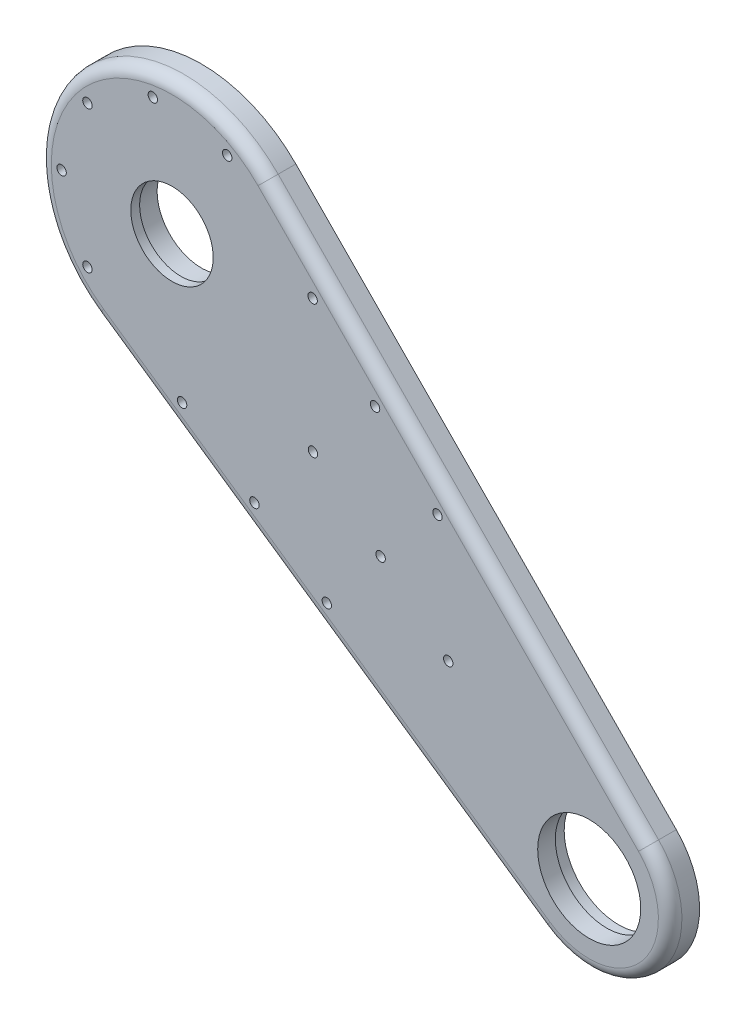
ISO-10303-21;
HEADER;
FILE_DESCRIPTION(('STEP AP214'),'2;1');
FILE_NAME('part.step','',(''),(''),'','','');
FILE_SCHEMA(('AUTOMOTIVE_DESIGN { 1 0 10303 214 1 1 1 1 }'));
ENDSEC;
DATA;
#1=APPLICATION_CONTEXT('core data for automotive mechanical design processes');
#2=APPLICATION_PROTOCOL_DEFINITION('international standard','automotive_design',2000,#1);
#3=PRODUCT_CONTEXT('',#1,'mechanical');
#4=PRODUCT('Part','Part','',(#3));
#5=PRODUCT_RELATED_PRODUCT_CATEGORY('part','',(#4));
#6=PRODUCT_DEFINITION_FORMATION('','',#4);
#7=PRODUCT_DEFINITION_CONTEXT('part definition',#1,'design');
#8=PRODUCT_DEFINITION('design','',#6,#7);
#9=PRODUCT_DEFINITION_SHAPE('','',#8);
#10=(LENGTH_UNIT() NAMED_UNIT(*) SI_UNIT(.MILLI.,.METRE.));
#11=(NAMED_UNIT(*) PLANE_ANGLE_UNIT() SI_UNIT($,.RADIAN.));
#12=(NAMED_UNIT(*) SI_UNIT($,.STERADIAN.) SOLID_ANGLE_UNIT());
#13=UNCERTAINTY_MEASURE_WITH_UNIT(LENGTH_MEASURE(1.E-05),#10,'distance_accuracy_value','');
#14=(GEOMETRIC_REPRESENTATION_CONTEXT(3) GLOBAL_UNCERTAINTY_ASSIGNED_CONTEXT((#13)) GLOBAL_UNIT_ASSIGNED_CONTEXT((#10,
#11,#12)) REPRESENTATION_CONTEXT('',''));
#15=CARTESIAN_POINT('',(0.,0.,0.));
#16=DIRECTION('',(0.,0.,1.));
#17=DIRECTION('',(1.,0.,0.));
#18=AXIS2_PLACEMENT_3D('',#15,#16,#17);
#19=CARTESIAN_POINT('',(0.,0.,47.));
#20=DIRECTION('',(0.,0.,-1.));
#21=DIRECTION('',(-1.,0.,0.));
#22=AXIS2_PLACEMENT_3D('',#19,#20,#21);
#23=CYLINDRICAL_SURFACE('',#22,14.);
#24=CARTESIAN_POINT('',(0.,0.,47.));
#25=DIRECTION('',(0.,0.,-1.));
#26=DIRECTION('',(-1.,0.,0.));
#27=AXIS2_PLACEMENT_3D('',#24,#25,#26);
#28=CIRCLE('',#27,14.);
#29=CARTESIAN_POINT('',(-14.,0.,47.));
#30=VERTEX_POINT('',#29);
#31=EDGE_CURVE('E215',#30,#30,#28,.T.);
#32=ORIENTED_EDGE('',*,*,#31,.F.);
#33=EDGE_LOOP('',(#32));
#34=FACE_BOUND('',#33,.T.);
#35=CARTESIAN_POINT('',(0.,0.,44.));
#36=DIRECTION('',(0.,0.,-1.));
#37=DIRECTION('',(-1.,0.,0.));
#38=AXIS2_PLACEMENT_3D('',#35,#36,#37);
#39=CIRCLE('',#38,14.);
#40=CARTESIAN_POINT('',(-14.,0.,44.));
#41=VERTEX_POINT('',#40);
#42=EDGE_CURVE('E203',#41,#41,#39,.T.);
#43=ORIENTED_EDGE('',*,*,#42,.T.);
#44=EDGE_LOOP('',(#43));
#45=FACE_BOUND('',#44,.T.);
#46=ADVANCED_FACE('F44',(#34,#45),#23,.F.);
#47=CARTESIAN_POINT('',(141.718221977011,-118.91570779201,47.));
#48=DIRECTION('',(0.,0.,-1.));
#49=DIRECTION('',(-1.,0.,0.));
#50=AXIS2_PLACEMENT_3D('',#47,#48,#49);
#51=CYLINDRICAL_SURFACE('',#50,17.5);
#52=CARTESIAN_POINT('',(141.718221977011,-118.91570779201,47.));
#53=DIRECTION('',(0.,0.,1.));
#54=DIRECTION('',(1.,0.,0.));
#55=AXIS2_PLACEMENT_3D('',#52,#53,#54);
#56=CIRCLE('',#55,17.5);
#57=CARTESIAN_POINT('',(159.218221977011,-118.91570779201,47.));
#58=VERTEX_POINT('',#57);
#59=EDGE_CURVE('E314',#58,#58,#56,.T.);
#60=ORIENTED_EDGE('',*,*,#59,.T.);
#61=EDGE_LOOP('',(#60));
#62=FACE_BOUND('',#61,.T.);
#63=CARTESIAN_POINT('',(141.718221977011,-118.91570779201,41.));
#64=DIRECTION('',(0.,0.,-1.));
#65=DIRECTION('',(-1.,0.,0.));
#66=AXIS2_PLACEMENT_3D('',#63,#64,#65);
#67=CIRCLE('',#66,17.5);
#68=CARTESIAN_POINT('',(124.218221977011,-118.91570779201,41.));
#69=VERTEX_POINT('',#68);
#70=EDGE_CURVE('E155',#69,#69,#67,.T.);
#71=ORIENTED_EDGE('',*,*,#70,.T.);
#72=EDGE_LOOP('',(#71));
#73=FACE_BOUND('',#72,.T.);
#74=ADVANCED_FACE('F349',(#62,#73),#51,.F.);
#75=CARTESIAN_POINT('',(0.,0.,47.));
#76=DIRECTION('',(0.,0.,1.));
#77=DIRECTION('',(1.,0.,0.));
#78=AXIS2_PLACEMENT_3D('',#75,#76,#77);
#79=PLANE('',#78);
#80=DIRECTION('',(0.823413639467006,-0.567441607867893,0.));
#81=VECTOR('',#80,1.);
#82=CARTESIAN_POINT('',(128.383344192115,-138.265928319485,47.));
#83=LINE('',#82,#81);
#84=CARTESIAN_POINT('',(-23.2651059225836,-33.7599592181472,47.));
#85=VERTEX_POINT('',#84);
#86=CARTESIAN_POINT('',(128.383344192115,-138.265928319485,47.));
#87=VERTEX_POINT('',#86);
#88=EDGE_CURVE('E166',#85,#87,#83,.T.);
#89=ORIENTED_EDGE('',*,*,#88,.T.);
#90=CARTESIAN_POINT('',(141.718221977011,-118.91570779201,47.));
#91=DIRECTION('',(0.,0.,1.));
#92=DIRECTION('',(1.,0.,0.));
#93=AXIS2_PLACEMENT_3D('',#90,#91,#92);
#94=CIRCLE('',#93,23.5);
#95=CARTESIAN_POINT('',(158.458891948205,-102.423286231926,47.));
#96=VERTEX_POINT('',#95);
#97=EDGE_CURVE('E169',#87,#96,#94,.T.);
#98=ORIENTED_EDGE('',*,*,#97,.T.);
#99=DIRECTION('',(-0.701805172769552,0.712368934944456,0.));
#100=VECTOR('',#99,1.);
#101=CARTESIAN_POINT('',(29.2071263327227,28.7740120835516,47.));
#102=LINE('',#101,#100);
#103=CARTESIAN_POINT('',(29.2071263327227,28.7740120835516,47.));
#104=VERTEX_POINT('',#103);
#105=EDGE_CURVE('E116',#96,#104,#102,.T.);
#106=ORIENTED_EDGE('',*,*,#105,.T.);
#107=CARTESIAN_POINT('',(0.,0.,47.));
#108=DIRECTION('',(0.,0.,1.));
#109=DIRECTION('',(1.,0.,0.));
#110=AXIS2_PLACEMENT_3D('',#107,#108,#109);
#111=CIRCLE('',#110,41.);
#112=EDGE_CURVE('E163',#104,#85,#111,.T.);
#113=ORIENTED_EDGE('',*,*,#112,.T.);
#114=EDGE_LOOP('',(#89,#98,#106,#113));
#115=FACE_BOUND('',#114,.T.);
#116=ORIENTED_EDGE('',*,*,#31,.T.);
#117=EDGE_LOOP('',(#116));
#118=FACE_BOUND('',#117,.T.);
#119=CARTESIAN_POINT('',(18.75,32.4759526419165,47.));
#120=DIRECTION('',(0.,0.,-1.));
#121=DIRECTION('',(-1.,0.,0.));
#122=AXIS2_PLACEMENT_3D('',#119,#120,#121);
#123=CIRCLE('',#122,1.6);
#124=CARTESIAN_POINT('',(17.15,32.4759526419165,47.));
#125=VERTEX_POINT('',#124);
#126=EDGE_CURVE('E220',#125,#125,#123,.T.);
#127=ORIENTED_EDGE('',*,*,#126,.T.);
#128=EDGE_LOOP('',(#127));
#129=FACE_BOUND('',#128,.T.);
#130=CARTESIAN_POINT('',(-6.51180666250989,36.9302907379578,47.));
#131=DIRECTION('',(0.,0.,-1.));
#132=DIRECTION('',(-1.,0.,0.));
#133=AXIS2_PLACEMENT_3D('',#130,#131,#132);
#134=CIRCLE('',#133,1.6);
#135=CARTESIAN_POINT('',(-8.11180666250989,36.9302907379578,47.));
#136=VERTEX_POINT('',#135);
#137=EDGE_CURVE('E232',#136,#136,#134,.T.);
#138=ORIENTED_EDGE('',*,*,#137,.T.);
#139=EDGE_LOOP('',(#138));
#140=FACE_BOUND('',#139,.T.);
#141=CARTESIAN_POINT('',(-28.7266666169617,24.1045353632452,47.));
#142=DIRECTION('',(0.,0.,-1.));
#143=DIRECTION('',(-1.,0.,0.));
#144=AXIS2_PLACEMENT_3D('',#141,#142,#143);
#145=CIRCLE('',#144,1.6);
#146=CARTESIAN_POINT('',(-30.3266666169617,24.1045353632452,47.));
#147=VERTEX_POINT('',#146);
#148=EDGE_CURVE('E239',#147,#147,#145,.T.);
#149=ORIENTED_EDGE('',*,*,#148,.T.);
#150=EDGE_LOOP('',(#149));
#151=FACE_BOUND('',#150,.T.);
#152=CARTESIAN_POINT('',(-37.5,0.,47.));
#153=DIRECTION('',(0.,0.,-1.));
#154=DIRECTION('',(-1.,0.,0.));
#155=AXIS2_PLACEMENT_3D('',#152,#153,#154);
#156=CIRCLE('',#155,1.6);
#157=CARTESIAN_POINT('',(-39.1,0.,47.));
#158=VERTEX_POINT('',#157);
#159=EDGE_CURVE('E247',#158,#158,#156,.T.);
#160=ORIENTED_EDGE('',*,*,#159,.T.);
#161=EDGE_LOOP('',(#160));
#162=FACE_BOUND('',#161,.T.);
#163=CARTESIAN_POINT('',(-28.7266666169617,-24.1045353632452,47.));
#164=DIRECTION('',(0.,0.,-1.));
#165=DIRECTION('',(-1.,0.,0.));
#166=AXIS2_PLACEMENT_3D('',#163,#164,#165);
#167=CIRCLE('',#166,1.6);
#168=CARTESIAN_POINT('',(-30.3266666169617,-24.1045353632452,47.));
#169=VERTEX_POINT('',#168);
#170=EDGE_CURVE('E219',#169,#169,#167,.T.);
#171=ORIENTED_EDGE('',*,*,#170,.T.);
#172=EDGE_LOOP('',(#171));
#173=FACE_BOUND('',#172,.T.);
#174=CARTESIAN_POINT('',(90.1797329704259,-37.4944400182162,47.));
#175=DIRECTION('',(0.,0.,1.));
#176=DIRECTION('',(1.,0.,0.));
#177=AXIS2_PLACEMENT_3D('',#174,#175,#176);
#178=CIRCLE('',#177,1.59999999999999);
#179=CARTESIAN_POINT('',(91.7797329704259,-37.4944400182162,47.));
#180=VERTEX_POINT('',#179);
#181=EDGE_CURVE('E272',#180,#180,#178,.T.);
#182=ORIENTED_EDGE('',*,*,#181,.F.);
#183=EDGE_LOOP('',(#182));
#184=FACE_BOUND('',#183,.T.);
#185=CARTESIAN_POINT('',(28.0038552032797,-65.1000593640452,47.));
#186=DIRECTION('',(0.,0.,1.));
#187=DIRECTION('',(1.,0.,0.));
#188=AXIS2_PLACEMENT_3D('',#185,#186,#187);
#189=CIRCLE('',#188,1.60000000000001);
#190=CARTESIAN_POINT('',(29.6038552032797,-65.1000593640452,47.));
#191=VERTEX_POINT('',#190);
#192=EDGE_CURVE('E287',#191,#191,#189,.T.);
#193=ORIENTED_EDGE('',*,*,#192,.F.);
#194=EDGE_LOOP('',(#193));
#195=FACE_BOUND('',#194,.T.);
#196=CARTESIAN_POINT('',(47.7679902435037,4.94662593052453,47.));
#197=DIRECTION('',(0.,0.,1.));
#198=DIRECTION('',(1.,0.,0.));
#199=AXIS2_PLACEMENT_3D('',#196,#197,#198);
#200=CIRCLE('',#199,1.6);
#201=CARTESIAN_POINT('',(49.3679902435037,4.94662593052453,47.));
#202=VERTEX_POINT('',#201);
#203=EDGE_CURVE('E303',#202,#202,#200,.T.);
#204=ORIENTED_EDGE('',*,*,#203,.F.);
#205=EDGE_LOOP('',(#204));
#206=FACE_BOUND('',#205,.T.);
#207=ORIENTED_EDGE('',*,*,#59,.F.);
#208=EDGE_LOOP('',(#207));
#209=FACE_BOUND('',#208,.T.);
#210=CARTESIAN_POINT('',(70.8591109885054,-59.457853896005,47.));
#211=DIRECTION('',(0.,0.,1.));
#212=DIRECTION('',(1.,0.,0.));
#213=AXIS2_PLACEMENT_3D('',#210,#211,#212);
#214=CIRCLE('',#213,1.60000000000001);
#215=CARTESIAN_POINT('',(72.4591109885054,-59.457853896005,47.));
#216=VERTEX_POINT('',#215);
#217=EDGE_CURVE('E133',#216,#216,#214,.T.);
#218=ORIENTED_EDGE('',*,*,#217,.F.);
#219=EDGE_LOOP('',(#218));
#220=FACE_BOUND('',#219,.T.);
#221=CARTESIAN_POINT('',(47.8777776949361,-40.1742256054088,47.));
#222=DIRECTION('',(0.,0.,1.));
#223=DIRECTION('',(1.,0.,0.));
#224=AXIS2_PLACEMENT_3D('',#221,#222,#223);
#225=CIRCLE('',#224,1.6);
#226=CARTESIAN_POINT('',(49.4777776949361,-40.1742256054088,47.));
#227=VERTEX_POINT('',#226);
#228=EDGE_CURVE('E321',#227,#227,#225,.T.);
#229=ORIENTED_EDGE('',*,*,#228,.F.);
#230=EDGE_LOOP('',(#229));
#231=FACE_BOUND('',#230,.T.);
#232=CARTESIAN_POINT('',(93.8404442820747,-78.7414821866012,47.));
#233=DIRECTION('',(0.,0.,1.));
#234=DIRECTION('',(1.,0.,0.));
#235=AXIS2_PLACEMENT_3D('',#232,#233,#234);
#236=CIRCLE('',#235,1.60000000000001);
#237=CARTESIAN_POINT('',(95.4404442820747,-78.7414821866012,47.));
#238=VERTEX_POINT('',#237);
#239=EDGE_CURVE('E310',#238,#238,#236,.T.);
#240=ORIENTED_EDGE('',*,*,#239,.F.);
#241=EDGE_LOOP('',(#240));
#242=FACE_BOUND('',#241,.T.);
#243=CARTESIAN_POINT('',(3.4233488889642,-47.9012597160495,47.));
#244=DIRECTION('',(0.,0.,1.));
#245=DIRECTION('',(1.,0.,0.));
#246=AXIS2_PLACEMENT_3D('',#243,#244,#245);
#247=CIRCLE('',#246,1.6);
#248=CARTESIAN_POINT('',(5.0233488889642,-47.9012597160495,47.));
#249=VERTEX_POINT('',#248);
#250=EDGE_CURVE('E295',#249,#249,#247,.T.);
#251=ORIENTED_EDGE('',*,*,#250,.F.);
#252=EDGE_LOOP('',(#251));
#253=FACE_BOUND('',#252,.T.);
#254=CARTESIAN_POINT('',(68.9738616069648,-16.2739070438458,47.));
#255=DIRECTION('',(0.,0.,1.));
#256=DIRECTION('',(1.,0.,0.));
#257=AXIS2_PLACEMENT_3D('',#254,#255,#256);
#258=CIRCLE('',#257,1.6);
#259=CARTESIAN_POINT('',(70.5738616069648,-16.2739070438458,47.));
#260=VERTEX_POINT('',#259);
#261=EDGE_CURVE('E279',#260,#260,#258,.T.);
#262=ORIENTED_EDGE('',*,*,#261,.F.);
#263=EDGE_LOOP('',(#262));
#264=FACE_BOUND('',#263,.T.);
#265=CARTESIAN_POINT('',(52.5843615175951,-82.298859012041,47.));
#266=DIRECTION('',(0.,0.,1.));
#267=DIRECTION('',(1.,0.,0.));
#268=AXIS2_PLACEMENT_3D('',#265,#266,#267);
#269=CIRCLE('',#268,1.60000000000001);
#270=CARTESIAN_POINT('',(54.1843615175951,-82.298859012041,47.));
#271=VERTEX_POINT('',#270);
#272=EDGE_CURVE('E264',#271,#271,#269,.T.);
#273=ORIENTED_EDGE('',*,*,#272,.F.);
#274=EDGE_LOOP('',(#273));
#275=FACE_BOUND('',#274,.T.);
#276=ADVANCED_FACE('F356',(#115,#118,#129,#140,#151,#162,#173,#184,#195,#206,#209,#220,#231,
#242,#253,#264,#275),#79,.T.);
#277=CARTESIAN_POINT('',(0.,0.,37.));
#278=DIRECTION('',(0.,0.,1.));
#279=DIRECTION('',(1.,0.,0.));
#280=AXIS2_PLACEMENT_3D('',#277,#278,#279);
#281=PLANE('',#280);
#282=CARTESIAN_POINT('',(0.,0.,37.));
#283=DIRECTION('',(0.,0.,-1.));
#284=DIRECTION('',(-1.,0.,0.));
#285=AXIS2_PLACEMENT_3D('',#282,#283,#284);
#286=CIRCLE('',#285,15.0625);
#287=CARTESIAN_POINT('',(-15.0625,0.,37.));
#288=VERTEX_POINT('',#287);
#289=EDGE_CURVE('E196',#288,#288,#286,.T.);
#290=ORIENTED_EDGE('',*,*,#289,.F.);
#291=EDGE_LOOP('',(#290));
#292=FACE_BOUND('',#291,.T.);
#293=CARTESIAN_POINT('',(18.75,32.4759526419165,37.));
#294=DIRECTION('',(0.,0.,-1.));
#295=DIRECTION('',(-1.,0.,0.));
#296=AXIS2_PLACEMENT_3D('',#293,#294,#295);
#297=CIRCLE('',#296,1.6);
#298=CARTESIAN_POINT('',(17.15,32.4759526419165,37.));
#299=VERTEX_POINT('',#298);
#300=EDGE_CURVE('E225',#299,#299,#297,.T.);
#301=ORIENTED_EDGE('',*,*,#300,.F.);
#302=EDGE_LOOP('',(#301));
#303=FACE_BOUND('',#302,.T.);
#304=CARTESIAN_POINT('',(-6.51180666250989,36.9302907379578,37.));
#305=DIRECTION('',(0.,0.,-1.));
#306=DIRECTION('',(-1.,0.,0.));
#307=AXIS2_PLACEMENT_3D('',#304,#305,#306);
#308=CIRCLE('',#307,1.6);
#309=CARTESIAN_POINT('',(-8.11180666250989,36.9302907379578,37.));
#310=VERTEX_POINT('',#309);
#311=EDGE_CURVE('E229',#310,#310,#308,.T.);
#312=ORIENTED_EDGE('',*,*,#311,.F.);
#313=EDGE_LOOP('',(#312));
#314=FACE_BOUND('',#313,.T.);
#315=CARTESIAN_POINT('',(-28.7266666169617,24.1045353632452,37.));
#316=DIRECTION('',(0.,0.,-1.));
#317=DIRECTION('',(-1.,0.,0.));
#318=AXIS2_PLACEMENT_3D('',#315,#316,#317);
#319=CIRCLE('',#318,1.6);
#320=CARTESIAN_POINT('',(-30.3266666169617,24.1045353632452,37.));
#321=VERTEX_POINT('',#320);
#322=EDGE_CURVE('E235',#321,#321,#319,.T.);
#323=ORIENTED_EDGE('',*,*,#322,.F.);
#324=EDGE_LOOP('',(#323));
#325=FACE_BOUND('',#324,.T.);
#326=CARTESIAN_POINT('',(-37.5,0.,37.));
#327=DIRECTION('',(0.,0.,-1.));
#328=DIRECTION('',(-1.,0.,0.));
#329=AXIS2_PLACEMENT_3D('',#326,#327,#328);
#330=CIRCLE('',#329,1.6);
#331=CARTESIAN_POINT('',(-39.1,0.,37.));
#332=VERTEX_POINT('',#331);
#333=EDGE_CURVE('E243',#332,#332,#330,.T.);
#334=ORIENTED_EDGE('',*,*,#333,.F.);
#335=EDGE_LOOP('',(#334));
#336=FACE_BOUND('',#335,.T.);
#337=CARTESIAN_POINT('',(-28.7266666169617,-24.1045353632452,37.));
#338=DIRECTION('',(0.,0.,-1.));
#339=DIRECTION('',(-1.,0.,0.));
#340=AXIS2_PLACEMENT_3D('',#337,#338,#339);
#341=CIRCLE('',#340,1.6);
#342=CARTESIAN_POINT('',(-30.3266666169617,-24.1045353632452,37.));
#343=VERTEX_POINT('',#342);
#344=EDGE_CURVE('E251',#343,#343,#341,.T.);
#345=ORIENTED_EDGE('',*,*,#344,.F.);
#346=EDGE_LOOP('',(#345));
#347=FACE_BOUND('',#346,.T.);
#348=CARTESIAN_POINT('',(141.718221977011,-118.91570779201,37.));
#349=DIRECTION('',(0.,0.,-1.));
#350=DIRECTION('',(-1.,0.,0.));
#351=AXIS2_PLACEMENT_3D('',#348,#349,#350);
#352=CIRCLE('',#351,18.5);
#353=CARTESIAN_POINT('',(123.218221977011,-118.91570779201,37.));
#354=VERTEX_POINT('',#353);
#355=EDGE_CURVE('E224',#354,#354,#352,.T.);
#356=ORIENTED_EDGE('',*,*,#355,.F.);
#357=EDGE_LOOP('',(#356));
#358=FACE_BOUND('',#357,.T.);
#359=CARTESIAN_POINT('',(0.,0.,37.));
#360=DIRECTION('',(0.,0.,1.));
#361=DIRECTION('',(1.,0.,0.));
#362=AXIS2_PLACEMENT_3D('',#359,#360,#361);
#363=CIRCLE('',#362,45.);
#364=CARTESIAN_POINT('',(32.0566020725005,31.5812327746298,37.));
#365=VERTEX_POINT('',#364);
#366=CARTESIAN_POINT('',(-25.5348723540552,-37.0536137760153,37.));
#367=VERTEX_POINT('',#366);
#368=EDGE_CURVE('E124',#365,#367,#363,.T.);
#369=ORIENTED_EDGE('',*,*,#368,.F.);
#370=DIRECTION('',(-0.701805172769552,0.712368934944456,0.));
#371=VECTOR('',#370,1.);
#372=CARTESIAN_POINT('',(32.0566020725005,31.5812327746298,37.));
#373=LINE('',#372,#371);
#374=CARTESIAN_POINT('',(161.308367687983,-99.6160655408473,37.));
#375=VERTEX_POINT('',#374);
#376=EDGE_CURVE('E145',#375,#365,#373,.T.);
#377=ORIENTED_EDGE('',*,*,#376,.F.);
#378=CARTESIAN_POINT('',(141.718221977011,-118.91570779201,37.));
#379=DIRECTION('',(0.,0.,1.));
#380=DIRECTION('',(1.,0.,0.));
#381=AXIS2_PLACEMENT_3D('',#378,#379,#380);
#382=CIRCLE('',#381,27.5);
#383=CARTESIAN_POINT('',(126.113577760644,-141.559582877353,37.));
#384=VERTEX_POINT('',#383);
#385=EDGE_CURVE('E126',#384,#375,#382,.T.);
#386=ORIENTED_EDGE('',*,*,#385,.F.);
#387=DIRECTION('',(0.823413639467006,-0.567441607867893,0.));
#388=VECTOR('',#387,1.);
#389=CARTESIAN_POINT('',(-25.5348723540552,-37.0536137760153,37.));
#390=LINE('',#389,#388);
#391=EDGE_CURVE('E112',#367,#384,#390,.T.);
#392=ORIENTED_EDGE('',*,*,#391,.F.);
#393=EDGE_LOOP('',(#369,#377,#386,#392));
#394=FACE_BOUND('',#393,.T.);
#395=CARTESIAN_POINT('',(70.8591109885054,-59.457853896005,37.));
#396=DIRECTION('',(0.,0.,1.));
#397=DIRECTION('',(1.,0.,0.));
#398=AXIS2_PLACEMENT_3D('',#395,#396,#397);
#399=CIRCLE('',#398,1.60000000000001);
#400=CARTESIAN_POINT('',(72.4591109885054,-59.457853896005,37.));
#401=VERTEX_POINT('',#400);
#402=EDGE_CURVE('E139',#401,#401,#399,.T.);
#403=ORIENTED_EDGE('',*,*,#402,.T.);
#404=EDGE_LOOP('',(#403));
#405=FACE_BOUND('',#404,.T.);
#406=CARTESIAN_POINT('',(47.8777776949361,-40.1742256054088,37.));
#407=DIRECTION('',(0.,0.,1.));
#408=DIRECTION('',(1.,0.,0.));
#409=AXIS2_PLACEMENT_3D('',#406,#407,#408);
#410=CIRCLE('',#409,1.6);
#411=CARTESIAN_POINT('',(49.4777776949361,-40.1742256054088,37.));
#412=VERTEX_POINT('',#411);
#413=EDGE_CURVE('E320',#412,#412,#410,.T.);
#414=ORIENTED_EDGE('',*,*,#413,.T.);
#415=EDGE_LOOP('',(#414));
#416=FACE_BOUND('',#415,.T.);
#417=CARTESIAN_POINT('',(93.8404442820747,-78.7414821866012,37.));
#418=DIRECTION('',(0.,0.,1.));
#419=DIRECTION('',(1.,0.,0.));
#420=AXIS2_PLACEMENT_3D('',#417,#418,#419);
#421=CIRCLE('',#420,1.60000000000001);
#422=CARTESIAN_POINT('',(95.4404442820747,-78.7414821866012,37.));
#423=VERTEX_POINT('',#422);
#424=EDGE_CURVE('E307',#423,#423,#421,.T.);
#425=ORIENTED_EDGE('',*,*,#424,.T.);
#426=EDGE_LOOP('',(#425));
#427=FACE_BOUND('',#426,.T.);
#428=CARTESIAN_POINT('',(47.7679902435037,4.94662593052453,37.));
#429=DIRECTION('',(0.,0.,1.));
#430=DIRECTION('',(1.,0.,0.));
#431=AXIS2_PLACEMENT_3D('',#428,#429,#430);
#432=CIRCLE('',#431,1.6);
#433=CARTESIAN_POINT('',(49.3679902435037,4.94662593052453,37.));
#434=VERTEX_POINT('',#433);
#435=EDGE_CURVE('E299',#434,#434,#432,.T.);
#436=ORIENTED_EDGE('',*,*,#435,.T.);
#437=EDGE_LOOP('',(#436));
#438=FACE_BOUND('',#437,.T.);
#439=CARTESIAN_POINT('',(3.4233488889642,-47.9012597160495,37.));
#440=DIRECTION('',(0.,0.,1.));
#441=DIRECTION('',(1.,0.,0.));
#442=AXIS2_PLACEMENT_3D('',#439,#440,#441);
#443=CIRCLE('',#442,1.6);
#444=CARTESIAN_POINT('',(5.0233488889642,-47.9012597160495,37.));
#445=VERTEX_POINT('',#444);
#446=EDGE_CURVE('E291',#445,#445,#443,.T.);
#447=ORIENTED_EDGE('',*,*,#446,.T.);
#448=EDGE_LOOP('',(#447));
#449=FACE_BOUND('',#448,.T.);
#450=CARTESIAN_POINT('',(28.0038552032797,-65.1000593640452,37.));
#451=DIRECTION('',(0.,0.,1.));
#452=DIRECTION('',(1.,0.,0.));
#453=AXIS2_PLACEMENT_3D('',#450,#451,#452);
#454=CIRCLE('',#453,1.60000000000001);
#455=CARTESIAN_POINT('',(29.6038552032797,-65.1000593640452,37.));
#456=VERTEX_POINT('',#455);
#457=EDGE_CURVE('E283',#456,#456,#454,.T.);
#458=ORIENTED_EDGE('',*,*,#457,.T.);
#459=EDGE_LOOP('',(#458));
#460=FACE_BOUND('',#459,.T.);
#461=CARTESIAN_POINT('',(68.9738616069648,-16.2739070438458,37.));
#462=DIRECTION('',(0.,0.,1.));
#463=DIRECTION('',(1.,0.,0.));
#464=AXIS2_PLACEMENT_3D('',#461,#462,#463);
#465=CIRCLE('',#464,1.6);
#466=CARTESIAN_POINT('',(70.5738616069648,-16.2739070438458,37.));
#467=VERTEX_POINT('',#466);
#468=EDGE_CURVE('E276',#467,#467,#465,.T.);
#469=ORIENTED_EDGE('',*,*,#468,.T.);
#470=EDGE_LOOP('',(#469));
#471=FACE_BOUND('',#470,.T.);
#472=CARTESIAN_POINT('',(90.1797329704259,-37.4944400182162,37.));
#473=DIRECTION('',(0.,0.,1.));
#474=DIRECTION('',(1.,0.,0.));
#475=AXIS2_PLACEMENT_3D('',#472,#473,#474);
#476=CIRCLE('',#475,1.59999999999999);
#477=CARTESIAN_POINT('',(91.7797329704259,-37.4944400182162,37.));
#478=VERTEX_POINT('',#477);
#479=EDGE_CURVE('E268',#478,#478,#476,.T.);
#480=ORIENTED_EDGE('',*,*,#479,.T.);
#481=EDGE_LOOP('',(#480));
#482=FACE_BOUND('',#481,.T.);
#483=CARTESIAN_POINT('',(52.5843615175951,-82.298859012041,37.));
#484=DIRECTION('',(0.,0.,1.));
#485=DIRECTION('',(1.,0.,0.));
#486=AXIS2_PLACEMENT_3D('',#483,#484,#485);
#487=CIRCLE('',#486,1.60000000000001);
#488=CARTESIAN_POINT('',(54.1843615175951,-82.298859012041,37.));
#489=VERTEX_POINT('',#488);
#490=EDGE_CURVE('E159',#489,#489,#487,.T.);
#491=ORIENTED_EDGE('',*,*,#490,.T.);
#492=EDGE_LOOP('',(#491));
#493=FACE_BOUND('',#492,.T.);
#494=ADVANCED_FACE('F121',(#292,#303,#314,#325,#336,#347,#358,#394,#405,#416,#427,#438,#449,
#460,#471,#482,#493),#281,.F.);
#495=CARTESIAN_POINT('',(0.,0.,47.));
#496=DIRECTION('',(0.,0.,-1.));
#497=DIRECTION('',(-1.,0.,0.));
#498=AXIS2_PLACEMENT_3D('',#495,#496,#497);
#499=CYLINDRICAL_SURFACE('',#498,45.);
#500=DIRECTION('',(0.,0.,-1.));
#501=VECTOR('',#500,1.);
#502=CARTESIAN_POINT('',(-25.5348723540552,-37.0536137760153,47.));
#503=LINE('',#502,#501);
#504=CARTESIAN_POINT('',(-25.5348723540552,-37.0536137760153,43.));
#505=VERTEX_POINT('',#504);
#506=EDGE_CURVE('E109',#505,#367,#503,.T.);
#507=ORIENTED_EDGE('',*,*,#506,.F.);
#508=CARTESIAN_POINT('',(0.,0.,43.));
#509=DIRECTION('',(0.,0.,1.));
#510=DIRECTION('',(1.,0.,0.));
#511=AXIS2_PLACEMENT_3D('',#508,#509,#510);
#512=CIRCLE('',#511,45.);
#513=CARTESIAN_POINT('',(32.0566020725005,31.5812327746298,43.));
#514=VERTEX_POINT('',#513);
#515=EDGE_CURVE('E54',#505,#514,#512,.F.);
#516=ORIENTED_EDGE('',*,*,#515,.T.);
#517=DIRECTION('',(0.,0.,-1.));
#518=VECTOR('',#517,1.);
#519=CARTESIAN_POINT('',(32.0566020725005,31.5812327746298,47.));
#520=LINE('',#519,#518);
#521=EDGE_CURVE('E130',#514,#365,#520,.T.);
#522=ORIENTED_EDGE('',*,*,#521,.T.);
#523=ORIENTED_EDGE('',*,*,#368,.T.);
#524=EDGE_LOOP('',(#507,#516,#522,#523));
#525=FACE_BOUND('',#524,.T.);
#526=ADVANCED_FACE('F129',(#525),#499,.T.);
#527=CARTESIAN_POINT('',(-25.5348723540552,-37.0536137760153,47.));
#528=DIRECTION('',(0.567441607867893,0.823413639467006,0.));
#529=DIRECTION('',(-0.823413639467006,0.567441607867893,0.));
#530=AXIS2_PLACEMENT_3D('',#527,#528,#529);
#531=PLANE('',#530);
#532=DIRECTION('',(0.,0.,-1.));
#533=VECTOR('',#532,1.);
#534=CARTESIAN_POINT('',(126.113577760644,-141.559582877353,47.));
#535=LINE('',#534,#533);
#536=CARTESIAN_POINT('',(126.113577760644,-141.559582877353,43.));
#537=VERTEX_POINT('',#536);
#538=EDGE_CURVE('E117',#537,#384,#535,.T.);
#539=ORIENTED_EDGE('',*,*,#538,.F.);
#540=DIRECTION('',(0.823413639467006,-0.567441607867893,0.));
#541=VECTOR('',#540,1.);
#542=CARTESIAN_POINT('',(-25.5348723540552,-37.0536137760153,43.));
#543=LINE('',#542,#541);
#544=EDGE_CURVE('E74',#537,#505,#543,.F.);
#545=ORIENTED_EDGE('',*,*,#544,.T.);
#546=ORIENTED_EDGE('',*,*,#506,.T.);
#547=ORIENTED_EDGE('',*,*,#391,.T.);
#548=EDGE_LOOP('',(#539,#545,#546,#547));
#549=FACE_BOUND('',#548,.T.);
#550=ADVANCED_FACE('F111',(#549),#531,.F.);
#551=CARTESIAN_POINT('',(141.718221977011,-118.91570779201,47.));
#552=DIRECTION('',(0.,0.,-1.));
#553=DIRECTION('',(-1.,0.,0.));
#554=AXIS2_PLACEMENT_3D('',#551,#552,#553);
#555=CYLINDRICAL_SURFACE('',#554,27.5);
#556=DIRECTION('',(0.,0.,-1.));
#557=VECTOR('',#556,1.);
#558=CARTESIAN_POINT('',(161.308367687983,-99.6160655408473,47.));
#559=LINE('',#558,#557);
#560=CARTESIAN_POINT('',(161.308367687983,-99.6160655408473,43.));
#561=VERTEX_POINT('',#560);
#562=EDGE_CURVE('E150',#561,#375,#559,.T.);
#563=ORIENTED_EDGE('',*,*,#562,.F.);
#564=CARTESIAN_POINT('',(141.718221977011,-118.91570779201,43.));
#565=DIRECTION('',(0.,0.,1.));
#566=DIRECTION('',(1.,0.,0.));
#567=AXIS2_PLACEMENT_3D('',#564,#565,#566);
#568=CIRCLE('',#567,27.5);
#569=EDGE_CURVE('E173',#561,#537,#568,.F.);
#570=ORIENTED_EDGE('',*,*,#569,.T.);
#571=ORIENTED_EDGE('',*,*,#538,.T.);
#572=ORIENTED_EDGE('',*,*,#385,.T.);
#573=EDGE_LOOP('',(#563,#570,#571,#572));
#574=FACE_BOUND('',#573,.T.);
#575=ADVANCED_FACE('F448',(#574),#555,.T.);
#576=CARTESIAN_POINT('',(32.0566020725005,31.5812327746298,47.));
#577=DIRECTION('',(-0.712368934944456,-0.701805172769552,0.));
#578=DIRECTION('',(0.701805172769552,-0.712368934944456,0.));
#579=AXIS2_PLACEMENT_3D('',#576,#577,#578);
#580=PLANE('',#579);
#581=ORIENTED_EDGE('',*,*,#521,.F.);
#582=DIRECTION('',(-0.701805172769552,0.712368934944456,0.));
#583=VECTOR('',#582,1.);
#584=CARTESIAN_POINT('',(161.308367687983,-99.6160655408473,43.));
#585=LINE('',#584,#583);
#586=EDGE_CURVE('E11',#514,#561,#585,.F.);
#587=ORIENTED_EDGE('',*,*,#586,.T.);
#588=ORIENTED_EDGE('',*,*,#562,.T.);
#589=ORIENTED_EDGE('',*,*,#376,.T.);
#590=EDGE_LOOP('',(#581,#587,#588,#589));
#591=FACE_BOUND('',#590,.T.);
#592=ADVANCED_FACE('F344',(#591),#580,.F.);
#593=CARTESIAN_POINT('',(70.8591109885054,-59.457853896005,47.));
#594=DIRECTION('',(0.,0.,-1.));
#595=DIRECTION('',(-1.,0.,0.));
#596=AXIS2_PLACEMENT_3D('',#593,#594,#595);
#597=CYLINDRICAL_SURFACE('',#596,1.60000000000001);
#598=ORIENTED_EDGE('',*,*,#217,.T.);
#599=EDGE_LOOP('',(#598));
#600=FACE_BOUND('',#599,.T.);
#601=ORIENTED_EDGE('',*,*,#402,.F.);
#602=EDGE_LOOP('',(#601));
#603=FACE_BOUND('',#602,.T.);
#604=ADVANCED_FACE('F334',(#600,#603),#597,.F.);
#605=CARTESIAN_POINT('',(47.8777776949361,-40.1742256054088,47.));
#606=DIRECTION('',(0.,0.,-1.));
#607=DIRECTION('',(-1.,0.,0.));
#608=AXIS2_PLACEMENT_3D('',#605,#606,#607);
#609=CYLINDRICAL_SURFACE('',#608,1.6);
#610=ORIENTED_EDGE('',*,*,#228,.T.);
#611=EDGE_LOOP('',(#610));
#612=FACE_BOUND('',#611,.T.);
#613=ORIENTED_EDGE('',*,*,#413,.F.);
#614=EDGE_LOOP('',(#613));
#615=FACE_BOUND('',#614,.T.);
#616=ADVANCED_FACE('F331',(#612,#615),#609,.F.);
#617=CARTESIAN_POINT('',(93.8404442820747,-78.7414821866012,47.));
#618=DIRECTION('',(0.,0.,-1.));
#619=DIRECTION('',(-1.,0.,0.));
#620=AXIS2_PLACEMENT_3D('',#617,#618,#619);
#621=CYLINDRICAL_SURFACE('',#620,1.60000000000001);
#622=ORIENTED_EDGE('',*,*,#239,.T.);
#623=EDGE_LOOP('',(#622));
#624=FACE_BOUND('',#623,.T.);
#625=ORIENTED_EDGE('',*,*,#424,.F.);
#626=EDGE_LOOP('',(#625));
#627=FACE_BOUND('',#626,.T.);
#628=ADVANCED_FACE('F333',(#624,#627),#621,.F.);
#629=CARTESIAN_POINT('',(47.7679902435037,4.94662593052453,47.));
#630=DIRECTION('',(0.,0.,-1.));
#631=DIRECTION('',(-1.,0.,0.));
#632=AXIS2_PLACEMENT_3D('',#629,#630,#631);
#633=CYLINDRICAL_SURFACE('',#632,1.6);
#634=ORIENTED_EDGE('',*,*,#203,.T.);
#635=EDGE_LOOP('',(#634));
#636=FACE_BOUND('',#635,.T.);
#637=ORIENTED_EDGE('',*,*,#435,.F.);
#638=EDGE_LOOP('',(#637));
#639=FACE_BOUND('',#638,.T.);
#640=ADVANCED_FACE('F340',(#636,#639),#633,.F.);
#641=CARTESIAN_POINT('',(3.4233488889642,-47.9012597160495,47.));
#642=DIRECTION('',(0.,0.,-1.));
#643=DIRECTION('',(-1.,0.,0.));
#644=AXIS2_PLACEMENT_3D('',#641,#642,#643);
#645=CYLINDRICAL_SURFACE('',#644,1.6);
#646=ORIENTED_EDGE('',*,*,#250,.T.);
#647=EDGE_LOOP('',(#646));
#648=FACE_BOUND('',#647,.T.);
#649=ORIENTED_EDGE('',*,*,#446,.F.);
#650=EDGE_LOOP('',(#649));
#651=FACE_BOUND('',#650,.T.);
#652=ADVANCED_FACE('F405',(#648,#651),#645,.F.);
#653=CARTESIAN_POINT('',(28.0038552032797,-65.1000593640452,47.));
#654=DIRECTION('',(0.,0.,-1.));
#655=DIRECTION('',(-1.,0.,0.));
#656=AXIS2_PLACEMENT_3D('',#653,#654,#655);
#657=CYLINDRICAL_SURFACE('',#656,1.60000000000001);
#658=ORIENTED_EDGE('',*,*,#192,.T.);
#659=EDGE_LOOP('',(#658));
#660=FACE_BOUND('',#659,.T.);
#661=ORIENTED_EDGE('',*,*,#457,.F.);
#662=EDGE_LOOP('',(#661));
#663=FACE_BOUND('',#662,.T.);
#664=ADVANCED_FACE('F401',(#660,#663),#657,.F.);
#665=CARTESIAN_POINT('',(68.9738616069648,-16.2739070438458,47.));
#666=DIRECTION('',(0.,0.,-1.));
#667=DIRECTION('',(-1.,0.,0.));
#668=AXIS2_PLACEMENT_3D('',#665,#666,#667);
#669=CYLINDRICAL_SURFACE('',#668,1.6);
#670=ORIENTED_EDGE('',*,*,#261,.T.);
#671=EDGE_LOOP('',(#670));
#672=FACE_BOUND('',#671,.T.);
#673=ORIENTED_EDGE('',*,*,#468,.F.);
#674=EDGE_LOOP('',(#673));
#675=FACE_BOUND('',#674,.T.);
#676=ADVANCED_FACE('F397',(#672,#675),#669,.F.);
#677=CARTESIAN_POINT('',(90.1797329704259,-37.4944400182162,47.));
#678=DIRECTION('',(0.,0.,-1.));
#679=DIRECTION('',(-1.,0.,0.));
#680=AXIS2_PLACEMENT_3D('',#677,#678,#679);
#681=CYLINDRICAL_SURFACE('',#680,1.59999999999999);
#682=ORIENTED_EDGE('',*,*,#181,.T.);
#683=EDGE_LOOP('',(#682));
#684=FACE_BOUND('',#683,.T.);
#685=ORIENTED_EDGE('',*,*,#479,.F.);
#686=EDGE_LOOP('',(#685));
#687=FACE_BOUND('',#686,.T.);
#688=ADVANCED_FACE('F393',(#684,#687),#681,.F.);
#689=CARTESIAN_POINT('',(52.5843615175951,-82.298859012041,47.));
#690=DIRECTION('',(0.,0.,-1.));
#691=DIRECTION('',(-1.,0.,0.));
#692=AXIS2_PLACEMENT_3D('',#689,#690,#691);
#693=CYLINDRICAL_SURFACE('',#692,1.60000000000001);
#694=ORIENTED_EDGE('',*,*,#272,.T.);
#695=EDGE_LOOP('',(#694));
#696=FACE_BOUND('',#695,.T.);
#697=ORIENTED_EDGE('',*,*,#490,.F.);
#698=EDGE_LOOP('',(#697));
#699=FACE_BOUND('',#698,.T.);
#700=ADVANCED_FACE('F390',(#696,#699),#693,.F.);
#701=CARTESIAN_POINT('',(141.718221977011,-118.91570779201,41.));
#702=DIRECTION('',(0.,0.,-1.));
#703=DIRECTION('',(-1.,0.,0.));
#704=AXIS2_PLACEMENT_3D('',#701,#702,#703);
#705=CYLINDRICAL_SURFACE('',#704,18.5);
#706=CARTESIAN_POINT('',(141.718221977011,-118.91570779201,41.));
#707=DIRECTION('',(0.,0.,-1.));
#708=DIRECTION('',(-1.,0.,0.));
#709=AXIS2_PLACEMENT_3D('',#706,#707,#708);
#710=CIRCLE('',#709,18.5);
#711=CARTESIAN_POINT('',(123.218221977011,-118.91570779201,41.));
#712=VERTEX_POINT('',#711);
#713=EDGE_CURVE('E160',#712,#712,#710,.T.);
#714=ORIENTED_EDGE('',*,*,#713,.F.);
#715=EDGE_LOOP('',(#714));
#716=FACE_BOUND('',#715,.T.);
#717=ORIENTED_EDGE('',*,*,#355,.T.);
#718=EDGE_LOOP('',(#717));
#719=FACE_BOUND('',#718,.T.);
#720=ADVANCED_FACE('F386',(#716,#719),#705,.F.);
#721=CARTESIAN_POINT('',(141.718221977011,-118.91570779201,41.));
#722=DIRECTION('',(0.,0.,-1.));
#723=DIRECTION('',(-1.,0.,0.));
#724=AXIS2_PLACEMENT_3D('',#721,#722,#723);
#725=PLANE('',#724);
#726=ORIENTED_EDGE('',*,*,#70,.F.);
#727=EDGE_LOOP('',(#726));
#728=FACE_BOUND('',#727,.T.);
#729=ORIENTED_EDGE('',*,*,#713,.T.);
#730=EDGE_LOOP('',(#729));
#731=FACE_BOUND('',#730,.T.);
#732=ADVANCED_FACE('F383',(#728,#731),#725,.T.);
#733=CARTESIAN_POINT('',(-28.7266666169617,-24.1045353632452,47.));
#734=DIRECTION('',(0.,0.,-1.));
#735=DIRECTION('',(-1.,0.,0.));
#736=AXIS2_PLACEMENT_3D('',#733,#734,#735);
#737=CYLINDRICAL_SURFACE('',#736,1.6);
#738=ORIENTED_EDGE('',*,*,#170,.F.);
#739=EDGE_LOOP('',(#738));
#740=FACE_BOUND('',#739,.T.);
#741=ORIENTED_EDGE('',*,*,#344,.T.);
#742=EDGE_LOOP('',(#741));
#743=FACE_BOUND('',#742,.T.);
#744=ADVANCED_FACE('F379',(#740,#743),#737,.F.);
#745=CARTESIAN_POINT('',(-37.5,0.,47.));
#746=DIRECTION('',(0.,0.,-1.));
#747=DIRECTION('',(-1.,0.,0.));
#748=AXIS2_PLACEMENT_3D('',#745,#746,#747);
#749=CYLINDRICAL_SURFACE('',#748,1.6);
#750=ORIENTED_EDGE('',*,*,#159,.F.);
#751=EDGE_LOOP('',(#750));
#752=FACE_BOUND('',#751,.T.);
#753=ORIENTED_EDGE('',*,*,#333,.T.);
#754=EDGE_LOOP('',(#753));
#755=FACE_BOUND('',#754,.T.);
#756=ADVANCED_FACE('F375',(#752,#755),#749,.F.);
#757=CARTESIAN_POINT('',(-28.7266666169617,24.1045353632452,47.));
#758=DIRECTION('',(0.,0.,-1.));
#759=DIRECTION('',(-1.,0.,0.));
#760=AXIS2_PLACEMENT_3D('',#757,#758,#759);
#761=CYLINDRICAL_SURFACE('',#760,1.6);
#762=ORIENTED_EDGE('',*,*,#148,.F.);
#763=EDGE_LOOP('',(#762));
#764=FACE_BOUND('',#763,.T.);
#765=ORIENTED_EDGE('',*,*,#322,.T.);
#766=EDGE_LOOP('',(#765));
#767=FACE_BOUND('',#766,.T.);
#768=ADVANCED_FACE('F371',(#764,#767),#761,.F.);
#769=CARTESIAN_POINT('',(-6.51180666250989,36.9302907379578,47.));
#770=DIRECTION('',(0.,0.,-1.));
#771=DIRECTION('',(-1.,0.,0.));
#772=AXIS2_PLACEMENT_3D('',#769,#770,#771);
#773=CYLINDRICAL_SURFACE('',#772,1.6);
#774=ORIENTED_EDGE('',*,*,#137,.F.);
#775=EDGE_LOOP('',(#774));
#776=FACE_BOUND('',#775,.T.);
#777=ORIENTED_EDGE('',*,*,#311,.T.);
#778=EDGE_LOOP('',(#777));
#779=FACE_BOUND('',#778,.T.);
#780=ADVANCED_FACE('F367',(#776,#779),#773,.F.);
#781=CARTESIAN_POINT('',(18.75,32.4759526419165,47.));
#782=DIRECTION('',(0.,0.,-1.));
#783=DIRECTION('',(-1.,0.,0.));
#784=AXIS2_PLACEMENT_3D('',#781,#782,#783);
#785=CYLINDRICAL_SURFACE('',#784,1.6);
#786=ORIENTED_EDGE('',*,*,#126,.F.);
#787=EDGE_LOOP('',(#786));
#788=FACE_BOUND('',#787,.T.);
#789=ORIENTED_EDGE('',*,*,#300,.T.);
#790=EDGE_LOOP('',(#789));
#791=FACE_BOUND('',#790,.T.);
#792=ADVANCED_FACE('F364',(#788,#791),#785,.F.);
#793=CARTESIAN_POINT('',(0.,0.,44.));
#794=DIRECTION('',(0.,0.,-1.));
#795=DIRECTION('',(-1.,0.,0.));
#796=AXIS2_PLACEMENT_3D('',#793,#794,#795);
#797=CYLINDRICAL_SURFACE('',#796,15.0625);
#798=CARTESIAN_POINT('',(0.,0.,44.));
#799=DIRECTION('',(0.,0.,-1.));
#800=DIRECTION('',(-1.,0.,0.));
#801=AXIS2_PLACEMENT_3D('',#798,#799,#800);
#802=CIRCLE('',#801,15.0625);
#803=CARTESIAN_POINT('',(-15.0625,0.,44.));
#804=VERTEX_POINT('',#803);
#805=EDGE_CURVE('E211',#804,#804,#802,.T.);
#806=ORIENTED_EDGE('',*,*,#805,.F.);
#807=EDGE_LOOP('',(#806));
#808=FACE_BOUND('',#807,.T.);
#809=ORIENTED_EDGE('',*,*,#289,.T.);
#810=EDGE_LOOP('',(#809));
#811=FACE_BOUND('',#810,.T.);
#812=ADVANCED_FACE('F362',(#808,#811),#797,.F.);
#813=CARTESIAN_POINT('',(0.,0.,44.));
#814=DIRECTION('',(0.,0.,-1.));
#815=DIRECTION('',(-1.,0.,0.));
#816=AXIS2_PLACEMENT_3D('',#813,#814,#815);
#817=PLANE('',#816);
#818=ORIENTED_EDGE('',*,*,#42,.F.);
#819=EDGE_LOOP('',(#818));
#820=FACE_BOUND('',#819,.T.);
#821=ORIENTED_EDGE('',*,*,#805,.T.);
#822=EDGE_LOOP('',(#821));
#823=FACE_BOUND('',#822,.T.);
#824=ADVANCED_FACE('F465',(#820,#823),#817,.T.);
#825=CARTESIAN_POINT('',(0.,0.,43.));
#826=DIRECTION('',(0.,0.,1.));
#827=DIRECTION('',(1.,0.,0.));
#828=AXIS2_PLACEMENT_3D('',#825,#826,#827);
#829=TOROIDAL_SURFACE('',#828,41.,4.);
#830=CARTESIAN_POINT('',(29.2071263327227,28.7740120835516,43.));
#831=DIRECTION('',(0.701805172769552,-0.712368934944457,0.));
#832=DIRECTION('',(0.712368934944457,0.701805172769552,0.));
#833=AXIS2_PLACEMENT_3D('',#830,#831,#832);
#834=CIRCLE('',#833,4.);
#835=EDGE_CURVE('E186',#514,#104,#834,.T.);
#836=ORIENTED_EDGE('',*,*,#835,.F.);
#837=ORIENTED_EDGE('',*,*,#515,.F.);
#838=CARTESIAN_POINT('',(-23.2651059225836,-33.7599592181472,43.));
#839=DIRECTION('',(0.823413639467006,-0.567441607867894,0.));
#840=DIRECTION('',(0.567441607867894,0.823413639467006,0.));
#841=AXIS2_PLACEMENT_3D('',#838,#839,#840);
#842=CIRCLE('',#841,4.);
#843=EDGE_CURVE('E48',#85,#505,#842,.T.);
#844=ORIENTED_EDGE('',*,*,#843,.F.);
#845=ORIENTED_EDGE('',*,*,#112,.F.);
#846=EDGE_LOOP('',(#836,#837,#844,#845));
#847=FACE_BOUND('',#846,.T.);
#848=ADVANCED_FACE('F46',(#847),#829,.T.);
#849=CARTESIAN_POINT('',(-23.2651059225836,-33.7599592181472,43.));
#850=DIRECTION('',(-0.823413639467006,0.567441607867893,0.));
#851=DIRECTION('',(-0.567441607867893,-0.823413639467006,0.));
#852=AXIS2_PLACEMENT_3D('',#849,#850,#851);
#853=CYLINDRICAL_SURFACE('',#852,4.);
#854=ORIENTED_EDGE('',*,*,#843,.T.);
#855=ORIENTED_EDGE('',*,*,#544,.F.);
#856=CARTESIAN_POINT('',(128.383344192115,-138.265928319485,43.));
#857=DIRECTION('',(0.823413639467009,-0.567441607867889,0.));
#858=DIRECTION('',(0.567441607867889,0.823413639467009,0.));
#859=AXIS2_PLACEMENT_3D('',#856,#857,#858);
#860=CIRCLE('',#859,4.);
#861=EDGE_CURVE('E184',#87,#537,#860,.T.);
#862=ORIENTED_EDGE('',*,*,#861,.F.);
#863=ORIENTED_EDGE('',*,*,#88,.F.);
#864=EDGE_LOOP('',(#854,#855,#862,#863));
#865=FACE_BOUND('',#864,.T.);
#866=ADVANCED_FACE('F461',(#865),#853,.T.);
#867=CARTESIAN_POINT('',(29.2071263327227,28.7740120835516,43.));
#868=DIRECTION('',(0.701805172769552,-0.712368934944456,0.));
#869=DIRECTION('',(0.712368934944456,0.701805172769552,0.));
#870=AXIS2_PLACEMENT_3D('',#867,#868,#869);
#871=CYLINDRICAL_SURFACE('',#870,4.);
#872=ORIENTED_EDGE('',*,*,#835,.T.);
#873=ORIENTED_EDGE('',*,*,#105,.F.);
#874=CARTESIAN_POINT('',(158.458891948205,-102.423286231926,43.));
#875=DIRECTION('',(0.701805172769554,-0.712368934944455,0.));
#876=DIRECTION('',(0.712368934944455,0.701805172769554,0.));
#877=AXIS2_PLACEMENT_3D('',#874,#875,#876);
#878=CIRCLE('',#877,4.);
#879=EDGE_CURVE('E181',#561,#96,#878,.T.);
#880=ORIENTED_EDGE('',*,*,#879,.F.);
#881=ORIENTED_EDGE('',*,*,#586,.F.);
#882=EDGE_LOOP('',(#872,#873,#880,#881));
#883=FACE_BOUND('',#882,.T.);
#884=ADVANCED_FACE('F458',(#883),#871,.T.);
#885=CARTESIAN_POINT('',(141.718221977011,-118.91570779201,43.));
#886=DIRECTION('',(0.,0.,1.));
#887=DIRECTION('',(1.,0.,0.));
#888=AXIS2_PLACEMENT_3D('',#885,#886,#887);
#889=TOROIDAL_SURFACE('',#888,23.5,4.);
#890=ORIENTED_EDGE('',*,*,#861,.T.);
#891=ORIENTED_EDGE('',*,*,#569,.F.);
#892=ORIENTED_EDGE('',*,*,#879,.T.);
#893=ORIENTED_EDGE('',*,*,#97,.F.);
#894=EDGE_LOOP('',(#890,#891,#892,#893));
#895=FACE_BOUND('',#894,.T.);
#896=ADVANCED_FACE('F455',(#895),#889,.T.);
#897=CLOSED_SHELL('',(#46,#74,#276,#494,#526,#550,#575,#592,#604,#616,#628,#640,#652,#664,#676,
#688,#700,#720,#732,#744,#756,#768,#780,#792,#812,#824,#848,#866,#884,#896));
#898=MANIFOLD_SOLID_BREP('B2',#897);
#899=ADVANCED_BREP_SHAPE_REPRESENTATION('',(#18,#898),#14);
#900=SHAPE_DEFINITION_REPRESENTATION(#9,#899);
ENDSEC;
END-ISO-10303-21;
